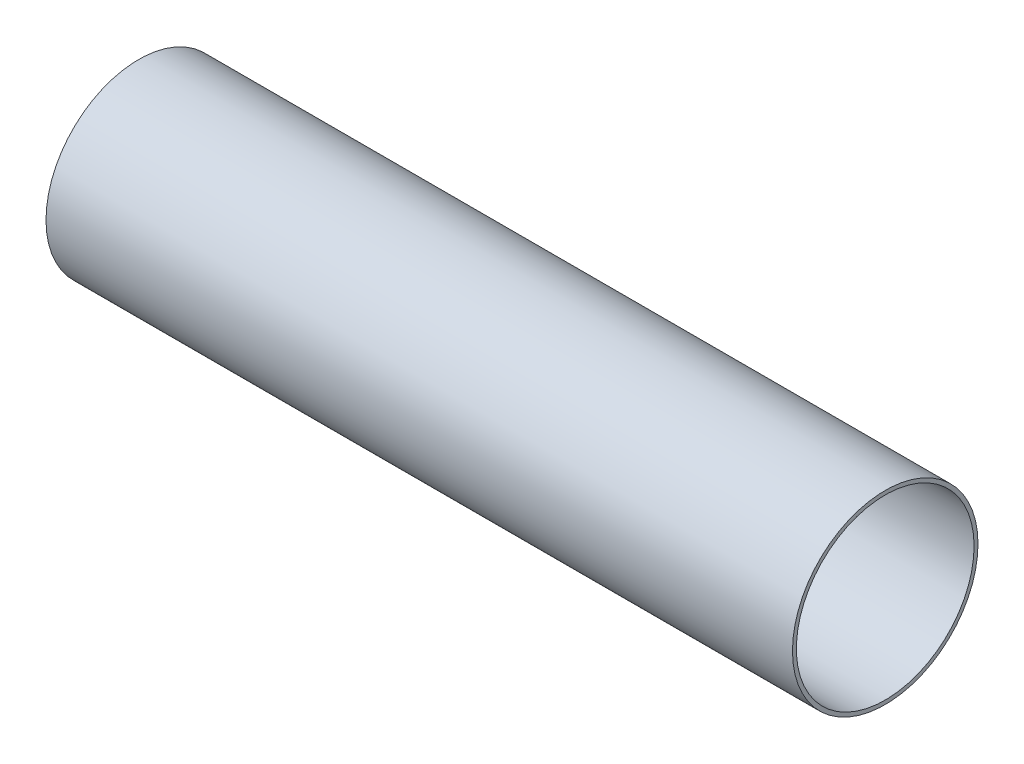
ISO-10303-21;
HEADER;
FILE_DESCRIPTION(('STEP AP214'),'2;1');
FILE_NAME('part.step','',(''),(''),'','','');
FILE_SCHEMA(('AUTOMOTIVE_DESIGN { 1 0 10303 214 1 1 1 1 }'));
ENDSEC;
DATA;
#1=APPLICATION_CONTEXT('core data for automotive mechanical design processes');
#2=APPLICATION_PROTOCOL_DEFINITION('international standard','automotive_design',2000,#1);
#3=PRODUCT_CONTEXT('',#1,'mechanical');
#4=PRODUCT('Part','Part','',(#3));
#5=PRODUCT_RELATED_PRODUCT_CATEGORY('part','',(#4));
#6=PRODUCT_DEFINITION_FORMATION('','',#4);
#7=PRODUCT_DEFINITION_CONTEXT('part definition',#1,'design');
#8=PRODUCT_DEFINITION('design','',#6,#7);
#9=PRODUCT_DEFINITION_SHAPE('','',#8);
#10=(LENGTH_UNIT() NAMED_UNIT(*) SI_UNIT(.MILLI.,.METRE.));
#11=(NAMED_UNIT(*) PLANE_ANGLE_UNIT() SI_UNIT($,.RADIAN.));
#12=(NAMED_UNIT(*) SI_UNIT($,.STERADIAN.) SOLID_ANGLE_UNIT());
#13=UNCERTAINTY_MEASURE_WITH_UNIT(LENGTH_MEASURE(1.E-05),#10,'distance_accuracy_value','');
#14=(GEOMETRIC_REPRESENTATION_CONTEXT(3) GLOBAL_UNCERTAINTY_ASSIGNED_CONTEXT((#13)) GLOBAL_UNIT_ASSIGNED_CONTEXT((#10,
#11,#12)) REPRESENTATION_CONTEXT('',''));
#15=CARTESIAN_POINT('',(0.,0.,0.));
#16=DIRECTION('',(0.,0.,1.));
#17=DIRECTION('',(1.,0.,0.));
#18=AXIS2_PLACEMENT_3D('',#15,#16,#17);
#19=CARTESIAN_POINT('',(106.68,0.,0.));
#20=DIRECTION('',(1.,0.,0.));
#21=DIRECTION('',(0.,0.,-1.));
#22=AXIS2_PLACEMENT_3D('',#19,#20,#21);
#23=PLANE('',#22);
#24=CARTESIAN_POINT('',(106.68,0.,0.));
#25=DIRECTION('',(1.,0.,0.));
#26=DIRECTION('',(0.,0.,-1.));
#27=AXIS2_PLACEMENT_3D('',#24,#25,#26);
#28=CIRCLE('',#27,26.516477777978);
#29=CARTESIAN_POINT('',(106.68,0.,-26.516477777978));
#30=VERTEX_POINT('',#29);
#31=EDGE_CURVE('E10',#30,#30,#28,.T.);
#32=ORIENTED_EDGE('',*,*,#31,.T.);
#33=EDGE_LOOP('',(#32));
#34=FACE_BOUND('',#33,.T.);
#35=CARTESIAN_POINT('',(106.68,0.,0.));
#36=DIRECTION('',(1.,0.,0.));
#37=DIRECTION('',(0.,0.,-1.));
#38=AXIS2_PLACEMENT_3D('',#35,#36,#37);
#39=CIRCLE('',#38,25.4);
#40=CARTESIAN_POINT('',(106.68,0.,-25.4));
#41=VERTEX_POINT('',#40);
#42=EDGE_CURVE('E46',#41,#41,#39,.T.);
#43=ORIENTED_EDGE('',*,*,#42,.F.);
#44=EDGE_LOOP('',(#43));
#45=FACE_BOUND('',#44,.T.);
#46=ADVANCED_FACE('F35',(#34,#45),#23,.T.);
#47=CARTESIAN_POINT('',(-106.68,0.,0.));
#48=DIRECTION('',(1.,0.,0.));
#49=DIRECTION('',(0.,0.,-1.));
#50=AXIS2_PLACEMENT_3D('',#47,#48,#49);
#51=PLANE('',#50);
#52=CARTESIAN_POINT('',(-106.68,0.,0.));
#53=DIRECTION('',(1.,0.,0.));
#54=DIRECTION('',(0.,0.,-1.));
#55=AXIS2_PLACEMENT_3D('',#52,#53,#54);
#56=CIRCLE('',#55,26.516477777978);
#57=CARTESIAN_POINT('',(-106.68,0.,-26.516477777978));
#58=VERTEX_POINT('',#57);
#59=EDGE_CURVE('E39',#58,#58,#56,.T.);
#60=ORIENTED_EDGE('',*,*,#59,.F.);
#61=EDGE_LOOP('',(#60));
#62=FACE_BOUND('',#61,.T.);
#63=CARTESIAN_POINT('',(-106.68,0.,0.));
#64=DIRECTION('',(1.,0.,0.));
#65=DIRECTION('',(0.,0.,-1.));
#66=AXIS2_PLACEMENT_3D('',#63,#64,#65);
#67=CIRCLE('',#66,25.4);
#68=CARTESIAN_POINT('',(-106.68,0.,-25.4));
#69=VERTEX_POINT('',#68);
#70=EDGE_CURVE('E48',#69,#69,#67,.T.);
#71=ORIENTED_EDGE('',*,*,#70,.T.);
#72=EDGE_LOOP('',(#71));
#73=FACE_BOUND('',#72,.T.);
#74=ADVANCED_FACE('F58',(#62,#73),#51,.F.);
#75=CARTESIAN_POINT('',(106.68,0.,0.));
#76=DIRECTION('',(-1.,0.,0.));
#77=DIRECTION('',(0.,0.,1.));
#78=AXIS2_PLACEMENT_3D('',#75,#76,#77);
#79=CYLINDRICAL_SURFACE('',#78,26.516477777978);
#80=ORIENTED_EDGE('',*,*,#31,.F.);
#81=EDGE_LOOP('',(#80));
#82=FACE_BOUND('',#81,.T.);
#83=ORIENTED_EDGE('',*,*,#59,.T.);
#84=EDGE_LOOP('',(#83));
#85=FACE_BOUND('',#84,.T.);
#86=ADVANCED_FACE('F37',(#82,#85),#79,.T.);
#87=CARTESIAN_POINT('',(106.68,0.,0.));
#88=DIRECTION('',(-1.,0.,0.));
#89=DIRECTION('',(0.,0.,1.));
#90=AXIS2_PLACEMENT_3D('',#87,#88,#89);
#91=CYLINDRICAL_SURFACE('',#90,25.4);
#92=ORIENTED_EDGE('',*,*,#42,.T.);
#93=EDGE_LOOP('',(#92));
#94=FACE_BOUND('',#93,.T.);
#95=ORIENTED_EDGE('',*,*,#70,.F.);
#96=EDGE_LOOP('',(#95));
#97=FACE_BOUND('',#96,.T.);
#98=ADVANCED_FACE('F54',(#94,#97),#91,.F.);
#99=CLOSED_SHELL('',(#46,#74,#86,#98));
#100=MANIFOLD_SOLID_BREP('B2',#99);
#101=ADVANCED_BREP_SHAPE_REPRESENTATION('',(#18,#100),#14);
#102=SHAPE_DEFINITION_REPRESENTATION(#9,#101);
ENDSEC;
END-ISO-10303-21;
